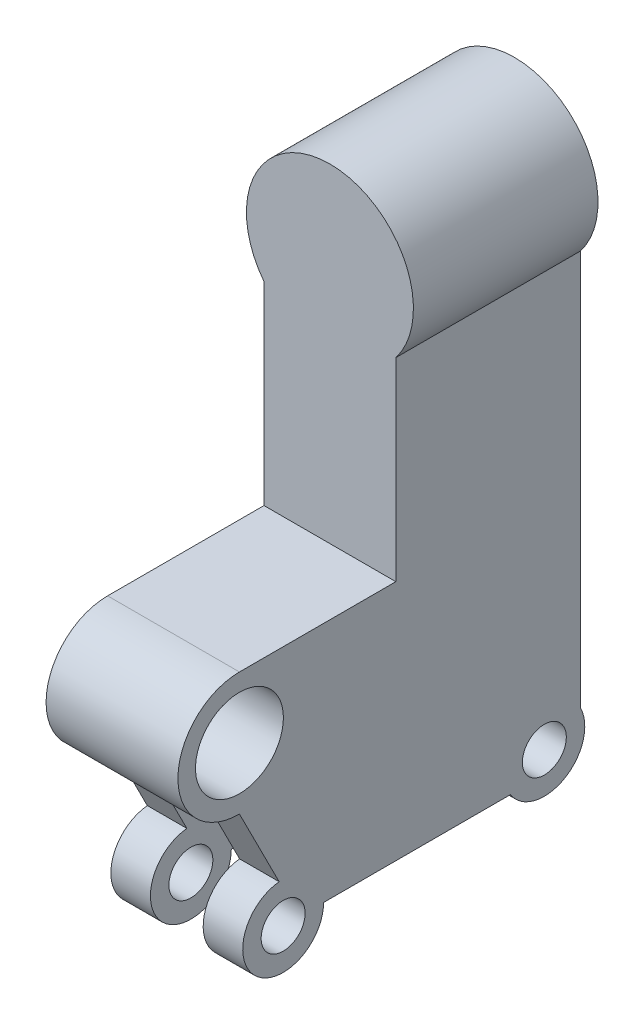
ISO-10303-21;
HEADER;
FILE_DESCRIPTION(('STEP AP214'),'2;1');
FILE_NAME('part.step','',(''),(''),'','','');
FILE_SCHEMA(('AUTOMOTIVE_DESIGN { 1 0 10303 214 1 1 1 1 }'));
ENDSEC;
DATA;
#1=APPLICATION_CONTEXT('core data for automotive mechanical design processes');
#2=APPLICATION_PROTOCOL_DEFINITION('international standard','automotive_design',2000,#1);
#3=PRODUCT_CONTEXT('',#1,'mechanical');
#4=PRODUCT('Part','Part','',(#3));
#5=PRODUCT_RELATED_PRODUCT_CATEGORY('part','',(#4));
#6=PRODUCT_DEFINITION_FORMATION('','',#4);
#7=PRODUCT_DEFINITION_CONTEXT('part definition',#1,'design');
#8=PRODUCT_DEFINITION('design','',#6,#7);
#9=PRODUCT_DEFINITION_SHAPE('','',#8);
#10=(LENGTH_UNIT() NAMED_UNIT(*) SI_UNIT(.MILLI.,.METRE.));
#11=(NAMED_UNIT(*) PLANE_ANGLE_UNIT() SI_UNIT($,.RADIAN.));
#12=(NAMED_UNIT(*) SI_UNIT($,.STERADIAN.) SOLID_ANGLE_UNIT());
#13=UNCERTAINTY_MEASURE_WITH_UNIT(LENGTH_MEASURE(1.E-05),#10,'distance_accuracy_value','');
#14=(GEOMETRIC_REPRESENTATION_CONTEXT(3) GLOBAL_UNCERTAINTY_ASSIGNED_CONTEXT((#13)) GLOBAL_UNIT_ASSIGNED_CONTEXT((#10,
#11,#12)) REPRESENTATION_CONTEXT('',''));
#15=CARTESIAN_POINT('',(0.,0.,0.));
#16=DIRECTION('',(0.,0.,1.));
#17=DIRECTION('',(1.,0.,0.));
#18=AXIS2_PLACEMENT_3D('',#15,#16,#17);
#19=CARTESIAN_POINT('',(15.,-18.,-34.6877878076393));
#20=DIRECTION('',(-1.,0.,0.));
#21=DIRECTION('',(0.,0.,1.));
#22=AXIS2_PLACEMENT_3D('',#19,#20,#21);
#23=CYLINDRICAL_SURFACE('',#22,4.6);
#24=CARTESIAN_POINT('',(4.5,-18.,-34.6877878076393));
#25=DIRECTION('',(-1.,0.,0.));
#26=DIRECTION('',(0.,0.,1.));
#27=AXIS2_PLACEMENT_3D('',#24,#25,#26);
#28=CIRCLE('',#27,4.6);
#29=CARTESIAN_POINT('',(4.5,-15.9227624252563,-38.7920641212021));
#30=VERTEX_POINT('',#29);
#31=CARTESIAN_POINT('',(4.5,-20.5,-30.8264408923777));
#32=VERTEX_POINT('',#31);
#33=EDGE_CURVE('E368',#30,#32,#28,.T.);
#34=ORIENTED_EDGE('',*,*,#33,.T.);
#35=DIRECTION('',(-1.,0.,0.));
#36=VECTOR('',#35,1.);
#37=CARTESIAN_POINT('',(15.,-20.5,-30.8264408923777));
#38=LINE('',#37,#36);
#39=CARTESIAN_POINT('',(0.,-20.5,-30.8264408923777));
#40=VERTEX_POINT('',#39);
#41=EDGE_CURVE('E160',#32,#40,#38,.T.);
#42=ORIENTED_EDGE('',*,*,#41,.T.);
#43=CARTESIAN_POINT('',(0.,-18.,-34.6877878076393));
#44=DIRECTION('',(1.,0.,0.));
#45=DIRECTION('',(0.,0.,-1.));
#46=AXIS2_PLACEMENT_3D('',#43,#44,#45);
#47=CIRCLE('',#46,4.6);
#48=CARTESIAN_POINT('',(0.,-15.9227624252563,-38.7920641212021));
#49=VERTEX_POINT('',#48);
#50=EDGE_CURVE('E199',#40,#49,#47,.T.);
#51=ORIENTED_EDGE('',*,*,#50,.T.);
#52=DIRECTION('',(-1.,0.,0.));
#53=VECTOR('',#52,1.);
#54=CARTESIAN_POINT('',(15.,-15.9227624252563,-38.7920641212021));
#55=LINE('',#54,#53);
#56=EDGE_CURVE('E161',#30,#49,#55,.T.);
#57=ORIENTED_EDGE('',*,*,#56,.F.);
#58=EDGE_LOOP('',(#34,#42,#51,#57));
#59=FACE_BOUND('',#58,.T.);
#60=ADVANCED_FACE('F55',(#59),#23,.T.);
#61=CARTESIAN_POINT('',(15.,-20.5,-4.97195036885488));
#62=DIRECTION('',(-1.,0.,0.));
#63=DIRECTION('',(0.,0.,1.));
#64=AXIS2_PLACEMENT_3D('',#61,#62,#63);
#65=CYLINDRICAL_SURFACE('',#64,4.6);
#66=CARTESIAN_POINT('',(10.5,-20.5,-4.97195036885488));
#67=DIRECTION('',(1.,0.,0.));
#68=DIRECTION('',(0.,0.,-1.));
#69=AXIS2_PLACEMENT_3D('',#66,#67,#68);
#70=CIRCLE('',#69,4.6);
#71=CARTESIAN_POINT('',(10.5,-15.9227624252563,-4.51489874774993));
#72=VERTEX_POINT('',#71);
#73=CARTESIAN_POINT('',(10.5,-20.5,-9.57195036885487));
#74=VERTEX_POINT('',#73);
#75=EDGE_CURVE('E314',#72,#74,#70,.T.);
#76=ORIENTED_EDGE('',*,*,#75,.T.);
#77=DIRECTION('',(-1.,0.,0.));
#78=VECTOR('',#77,1.);
#79=CARTESIAN_POINT('',(15.,-20.5,-9.57195036885487));
#80=LINE('',#79,#78);
#81=CARTESIAN_POINT('',(15.,-20.5,-9.57195036885487));
#82=VERTEX_POINT('',#81);
#83=EDGE_CURVE('E224',#82,#74,#80,.T.);
#84=ORIENTED_EDGE('',*,*,#83,.F.);
#85=CARTESIAN_POINT('',(15.,-20.5,-4.97195036885488));
#86=DIRECTION('',(1.,0.,0.));
#87=DIRECTION('',(0.,0.,-1.));
#88=AXIS2_PLACEMENT_3D('',#85,#86,#87);
#89=CIRCLE('',#88,4.6);
#90=CARTESIAN_POINT('',(15.,-15.9227624252563,-4.51489874774993));
#91=VERTEX_POINT('',#90);
#92=EDGE_CURVE('E286',#91,#82,#89,.T.);
#93=ORIENTED_EDGE('',*,*,#92,.F.);
#94=DIRECTION('',(-1.,0.,0.));
#95=VECTOR('',#94,1.);
#96=CARTESIAN_POINT('',(15.,-15.9227624252563,-4.51489874774993));
#97=LINE('',#96,#95);
#98=EDGE_CURVE('E229',#91,#72,#97,.T.);
#99=ORIENTED_EDGE('',*,*,#98,.T.);
#100=EDGE_LOOP('',(#76,#84,#93,#99));
#101=FACE_BOUND('',#100,.T.);
#102=ADVANCED_FACE('F311',(#101),#65,.T.);
#103=CARTESIAN_POINT('',(15.,-20.5,-4.97195036885488));
#104=DIRECTION('',(-1.,0.,0.));
#105=DIRECTION('',(0.,0.,1.));
#106=AXIS2_PLACEMENT_3D('',#103,#104,#105);
#107=CYLINDRICAL_SURFACE('',#106,2.5);
#108=CARTESIAN_POINT('',(15.,-20.5,-4.97195036885488));
#109=DIRECTION('',(1.,0.,0.));
#110=DIRECTION('',(0.,0.,-1.));
#111=AXIS2_PLACEMENT_3D('',#108,#109,#110);
#112=CIRCLE('',#111,2.5);
#113=CARTESIAN_POINT('',(15.,-20.5,-7.47195036885487));
#114=VERTEX_POINT('',#113);
#115=EDGE_CURVE('E264',#114,#114,#112,.T.);
#116=ORIENTED_EDGE('',*,*,#115,.T.);
#117=EDGE_LOOP('',(#116));
#118=FACE_BOUND('',#117,.T.);
#119=CARTESIAN_POINT('',(10.5,-20.5,-4.97195036885488));
#120=DIRECTION('',(1.,0.,0.));
#121=DIRECTION('',(0.,0.,-1.));
#122=AXIS2_PLACEMENT_3D('',#119,#120,#121);
#123=CIRCLE('',#122,2.5);
#124=CARTESIAN_POINT('',(10.5,-20.5,-7.47195036885487));
#125=VERTEX_POINT('',#124);
#126=EDGE_CURVE('E357',#125,#125,#123,.T.);
#127=ORIENTED_EDGE('',*,*,#126,.F.);
#128=EDGE_LOOP('',(#127));
#129=FACE_BOUND('',#128,.T.);
#130=ADVANCED_FACE('F433',(#118,#129),#107,.F.);
#131=CARTESIAN_POINT('',(15.,-20.5,-9.57195036885487));
#132=DIRECTION('',(0.,1.,0.));
#133=DIRECTION('',(0.,0.,1.));
#134=AXIS2_PLACEMENT_3D('',#131,#132,#133);
#135=PLANE('',#134);
#136=ORIENTED_EDGE('',*,*,#83,.T.);
#137=DIRECTION('',(0.,0.,1.));
#138=VECTOR('',#137,1.);
#139=CARTESIAN_POINT('',(10.5,-20.5,-39.2877878076393));
#140=LINE('',#139,#138);
#141=CARTESIAN_POINT('',(10.5,-20.5,-30.8264408923777));
#142=VERTEX_POINT('',#141);
#143=EDGE_CURVE('E319',#142,#74,#140,.T.);
#144=ORIENTED_EDGE('',*,*,#143,.F.);
#145=CARTESIAN_POINT('',(15.,-20.5,-30.8264408923777));
#146=VERTEX_POINT('',#145);
#147=EDGE_CURVE('E220',#146,#142,#38,.T.);
#148=ORIENTED_EDGE('',*,*,#147,.F.);
#149=DIRECTION('',(0.,0.,-1.));
#150=VECTOR('',#149,1.);
#151=CARTESIAN_POINT('',(15.,-20.5,-9.57195036885487));
#152=LINE('',#151,#150);
#153=EDGE_CURVE('E143',#82,#146,#152,.T.);
#154=ORIENTED_EDGE('',*,*,#153,.F.);
#155=EDGE_LOOP('',(#136,#144,#148,#154));
#156=FACE_BOUND('',#155,.T.);
#157=ADVANCED_FACE('F249',(#156),#135,.F.);
#158=CARTESIAN_POINT('',(15.,-18.,-34.6877878076393));
#159=DIRECTION('',(-1.,0.,0.));
#160=DIRECTION('',(0.,0.,1.));
#161=AXIS2_PLACEMENT_3D('',#158,#159,#160);
#162=CYLINDRICAL_SURFACE('',#161,2.5);
#163=CARTESIAN_POINT('',(10.5,-18.,-34.6877878076393));
#164=DIRECTION('',(1.,0.,0.));
#165=DIRECTION('',(0.,0.,-1.));
#166=AXIS2_PLACEMENT_3D('',#163,#164,#165);
#167=CIRCLE('',#166,2.5);
#168=CARTESIAN_POINT('',(10.5,-18.,-37.1877878076393));
#169=VERTEX_POINT('',#168);
#170=EDGE_CURVE('E64',#169,#169,#167,.T.);
#171=ORIENTED_EDGE('',*,*,#170,.F.);
#172=EDGE_LOOP('',(#171));
#173=FACE_BOUND('',#172,.T.);
#174=CARTESIAN_POINT('',(15.,-18.,-34.6877878076393));
#175=DIRECTION('',(1.,0.,0.));
#176=DIRECTION('',(0.,0.,-1.));
#177=AXIS2_PLACEMENT_3D('',#174,#175,#176);
#178=CIRCLE('',#177,2.5);
#179=CARTESIAN_POINT('',(15.,-18.,-37.1877878076393));
#180=VERTEX_POINT('',#179);
#181=EDGE_CURVE('E254',#180,#180,#178,.T.);
#182=ORIENTED_EDGE('',*,*,#181,.T.);
#183=EDGE_LOOP('',(#182));
#184=FACE_BOUND('',#183,.T.);
#185=ADVANCED_FACE('F246',(#173,#184),#162,.F.);
#186=CARTESIAN_POINT('',(15.,0.,0.));
#187=DIRECTION('',(1.,0.,0.));
#188=DIRECTION('',(0.,0.,-1.));
#189=AXIS2_PLACEMENT_3D('',#186,#187,#188);
#190=PLANE('',#189);
#191=ORIENTED_EDGE('',*,*,#115,.F.);
#192=EDGE_LOOP('',(#191));
#193=FACE_BOUND('',#192,.T.);
#194=CARTESIAN_POINT('',(15.,0.,0.));
#195=DIRECTION('',(1.,0.,0.));
#196=DIRECTION('',(0.,0.,-1.));
#197=AXIS2_PLACEMENT_3D('',#194,#195,#196);
#198=CIRCLE('',#197,7.);
#199=CARTESIAN_POINT('',(15.,7.,0.));
#200=VERTEX_POINT('',#199);
#201=CARTESIAN_POINT('',(15.,-7.,0.));
#202=VERTEX_POINT('',#201);
#203=EDGE_CURVE('E214',#200,#202,#198,.T.);
#204=ORIENTED_EDGE('',*,*,#203,.T.);
#205=DIRECTION('',(0.,-0.892276242525633,-0.451489874774993));
#206=VECTOR('',#205,1.);
#207=CARTESIAN_POINT('',(15.,-7.,0.));
#208=LINE('',#207,#206);
#209=EDGE_CURVE('E121',#202,#91,#208,.T.);
#210=ORIENTED_EDGE('',*,*,#209,.T.);
#211=ORIENTED_EDGE('',*,*,#92,.T.);
#212=ORIENTED_EDGE('',*,*,#153,.T.);
#213=CARTESIAN_POINT('',(15.,-18.,-34.6877878076393));
#214=DIRECTION('',(1.,0.,0.));
#215=DIRECTION('',(0.,0.,-1.));
#216=AXIS2_PLACEMENT_3D('',#213,#214,#215);
#217=CIRCLE('',#216,4.6);
#218=CARTESIAN_POINT('',(15.,-15.9227624252563,-38.7920641212021));
#219=VERTEX_POINT('',#218);
#220=EDGE_CURVE('E134',#146,#219,#217,.T.);
#221=ORIENTED_EDGE('',*,*,#220,.T.);
#222=DIRECTION('',(0.,1.,0.));
#223=VECTOR('',#222,1.);
#224=CARTESIAN_POINT('',(15.,-15.9227624252563,-38.7920641212021));
#225=LINE('',#224,#223);
#226=CARTESIAN_POINT('',(15.,29.0772375747437,-38.7920641212021));
#227=VERTEX_POINT('',#226);
#228=EDGE_CURVE('E141',#219,#227,#225,.T.);
#229=ORIENTED_EDGE('',*,*,#228,.T.);
#230=DIRECTION('',(0.,0.,1.));
#231=VECTOR('',#230,1.);
#232=CARTESIAN_POINT('',(15.,29.0772375747437,-17.7920641212021));
#233=LINE('',#232,#231);
#234=CARTESIAN_POINT('',(15.,29.0772375747437,-17.7920641212021));
#235=VERTEX_POINT('',#234);
#236=EDGE_CURVE('E169',#227,#235,#233,.T.);
#237=ORIENTED_EDGE('',*,*,#236,.T.);
#238=DIRECTION('',(0.,-1.,0.));
#239=VECTOR('',#238,1.);
#240=CARTESIAN_POINT('',(15.,7.,-17.7920641212021));
#241=LINE('',#240,#239);
#242=CARTESIAN_POINT('',(15.,7.,-17.7920641212021));
#243=VERTEX_POINT('',#242);
#244=EDGE_CURVE('E173',#235,#243,#241,.T.);
#245=ORIENTED_EDGE('',*,*,#244,.T.);
#246=DIRECTION('',(0.,0.,1.));
#247=VECTOR('',#246,1.);
#248=CARTESIAN_POINT('',(15.,7.,0.));
#249=LINE('',#248,#247);
#250=EDGE_CURVE('E79',#243,#200,#249,.T.);
#251=ORIENTED_EDGE('',*,*,#250,.T.);
#252=EDGE_LOOP('',(#204,#210,#211,#212,#221,#229,#237,#245,#251));
#253=FACE_BOUND('',#252,.T.);
#254=CARTESIAN_POINT('',(15.,0.,0.));
#255=DIRECTION('',(1.,0.,0.));
#256=DIRECTION('',(0.,0.,-1.));
#257=AXIS2_PLACEMENT_3D('',#254,#255,#256);
#258=CIRCLE('',#257,5.);
#259=CARTESIAN_POINT('',(15.,0.,-5.));
#260=VERTEX_POINT('',#259);
#261=EDGE_CURVE('E187',#260,#260,#258,.T.);
#262=ORIENTED_EDGE('',*,*,#261,.F.);
#263=EDGE_LOOP('',(#262));
#264=FACE_BOUND('',#263,.T.);
#265=ORIENTED_EDGE('',*,*,#181,.F.);
#266=EDGE_LOOP('',(#265));
#267=FACE_BOUND('',#266,.T.);
#268=ADVANCED_FACE('F136',(#193,#253,#264,#267),#190,.T.);
#269=CARTESIAN_POINT('',(0.,0.,0.));
#270=DIRECTION('',(1.,0.,0.));
#271=DIRECTION('',(0.,0.,-1.));
#272=AXIS2_PLACEMENT_3D('',#269,#270,#271);
#273=PLANE('',#272);
#274=CARTESIAN_POINT('',(0.,0.,0.));
#275=DIRECTION('',(1.,0.,0.));
#276=DIRECTION('',(0.,0.,-1.));
#277=AXIS2_PLACEMENT_3D('',#274,#275,#276);
#278=CIRCLE('',#277,7.);
#279=CARTESIAN_POINT('',(0.,7.,0.));
#280=VERTEX_POINT('',#279);
#281=CARTESIAN_POINT('',(0.,-7.,0.));
#282=VERTEX_POINT('',#281);
#283=EDGE_CURVE('E182',#280,#282,#278,.T.);
#284=ORIENTED_EDGE('',*,*,#283,.F.);
#285=DIRECTION('',(0.,0.,1.));
#286=VECTOR('',#285,1.);
#287=CARTESIAN_POINT('',(0.,7.,0.));
#288=LINE('',#287,#286);
#289=CARTESIAN_POINT('',(0.,7.,-17.7920641212021));
#290=VERTEX_POINT('',#289);
#291=EDGE_CURVE('E112',#290,#280,#288,.T.);
#292=ORIENTED_EDGE('',*,*,#291,.F.);
#293=DIRECTION('',(0.,-1.,0.));
#294=VECTOR('',#293,1.);
#295=CARTESIAN_POINT('',(0.,7.,-17.7920641212021));
#296=LINE('',#295,#294);
#297=CARTESIAN_POINT('',(0.,29.0772375747437,-17.7920641212021));
#298=VERTEX_POINT('',#297);
#299=EDGE_CURVE('E209',#298,#290,#296,.T.);
#300=ORIENTED_EDGE('',*,*,#299,.F.);
#301=DIRECTION('',(0.,0.,1.));
#302=VECTOR('',#301,1.);
#303=CARTESIAN_POINT('',(0.,29.0772375747437,-17.7920641212021));
#304=LINE('',#303,#302);
#305=CARTESIAN_POINT('',(0.,29.0772375747437,-38.7920641212021));
#306=VERTEX_POINT('',#305);
#307=EDGE_CURVE('E206',#306,#298,#304,.T.);
#308=ORIENTED_EDGE('',*,*,#307,.F.);
#309=DIRECTION('',(0.,1.,0.));
#310=VECTOR('',#309,1.);
#311=CARTESIAN_POINT('',(0.,-15.9227624252563,-38.7920641212021));
#312=LINE('',#311,#310);
#313=EDGE_CURVE('E203',#49,#306,#312,.T.);
#314=ORIENTED_EDGE('',*,*,#313,.F.);
#315=ORIENTED_EDGE('',*,*,#50,.F.);
#316=DIRECTION('',(0.,0.,-1.));
#317=VECTOR('',#316,1.);
#318=CARTESIAN_POINT('',(0.,-20.5,-9.57195036885487));
#319=LINE('',#318,#317);
#320=CARTESIAN_POINT('',(0.,-20.5,-9.57195036885487));
#321=VERTEX_POINT('',#320);
#322=EDGE_CURVE('E195',#321,#40,#319,.T.);
#323=ORIENTED_EDGE('',*,*,#322,.F.);
#324=CARTESIAN_POINT('',(0.,-20.5,-4.97195036885488));
#325=DIRECTION('',(1.,0.,0.));
#326=DIRECTION('',(0.,0.,-1.));
#327=AXIS2_PLACEMENT_3D('',#324,#325,#326);
#328=CIRCLE('',#327,4.6);
#329=CARTESIAN_POINT('',(0.,-15.9227624252563,-4.51489874774993));
#330=VERTEX_POINT('',#329);
#331=EDGE_CURVE('E191',#330,#321,#328,.T.);
#332=ORIENTED_EDGE('',*,*,#331,.F.);
#333=DIRECTION('',(0.,-0.892276242525633,-0.451489874774993));
#334=VECTOR('',#333,1.);
#335=CARTESIAN_POINT('',(0.,-7.,0.));
#336=LINE('',#335,#334);
#337=EDGE_CURVE('E186',#282,#330,#336,.T.);
#338=ORIENTED_EDGE('',*,*,#337,.F.);
#339=EDGE_LOOP('',(#284,#292,#300,#308,#314,#315,#323,#332,#338));
#340=FACE_BOUND('',#339,.T.);
#341=CARTESIAN_POINT('',(0.,0.,0.));
#342=DIRECTION('',(1.,0.,0.));
#343=DIRECTION('',(0.,0.,-1.));
#344=AXIS2_PLACEMENT_3D('',#341,#342,#343);
#345=CIRCLE('',#344,5.);
#346=CARTESIAN_POINT('',(0.,0.,-5.));
#347=VERTEX_POINT('',#346);
#348=EDGE_CURVE('E274',#347,#347,#345,.T.);
#349=ORIENTED_EDGE('',*,*,#348,.T.);
#350=EDGE_LOOP('',(#349));
#351=FACE_BOUND('',#350,.T.);
#352=CARTESIAN_POINT('',(0.,-20.5,-4.97195036885488));
#353=DIRECTION('',(1.,0.,0.));
#354=DIRECTION('',(0.,0.,-1.));
#355=AXIS2_PLACEMENT_3D('',#352,#353,#354);
#356=CIRCLE('',#355,2.5);
#357=CARTESIAN_POINT('',(0.,-20.5,-7.47195036885487));
#358=VERTEX_POINT('',#357);
#359=EDGE_CURVE('E257',#358,#358,#356,.T.);
#360=ORIENTED_EDGE('',*,*,#359,.T.);
#361=EDGE_LOOP('',(#360));
#362=FACE_BOUND('',#361,.T.);
#363=CARTESIAN_POINT('',(0.,-18.,-34.6877878076393));
#364=DIRECTION('',(1.,0.,0.));
#365=DIRECTION('',(0.,0.,-1.));
#366=AXIS2_PLACEMENT_3D('',#363,#364,#365);
#367=CIRCLE('',#366,2.5);
#368=CARTESIAN_POINT('',(0.,-18.,-37.1877878076393));
#369=VERTEX_POINT('',#368);
#370=EDGE_CURVE('E258',#369,#369,#367,.T.);
#371=ORIENTED_EDGE('',*,*,#370,.T.);
#372=EDGE_LOOP('',(#371));
#373=FACE_BOUND('',#372,.T.);
#374=ADVANCED_FACE('F445',(#340,#351,#362,#373),#273,.F.);
#375=CARTESIAN_POINT('',(15.,0.,0.));
#376=DIRECTION('',(-1.,0.,0.));
#377=DIRECTION('',(0.,0.,1.));
#378=AXIS2_PLACEMENT_3D('',#375,#376,#377);
#379=CYLINDRICAL_SURFACE('',#378,7.);
#380=ORIENTED_EDGE('',*,*,#283,.T.);
#381=DIRECTION('',(-1.,0.,0.));
#382=VECTOR('',#381,1.);
#383=CARTESIAN_POINT('',(15.,-7.,0.));
#384=LINE('',#383,#382);
#385=EDGE_CURVE('E233',#202,#282,#384,.T.);
#386=ORIENTED_EDGE('',*,*,#385,.F.);
#387=ORIENTED_EDGE('',*,*,#203,.F.);
#388=DIRECTION('',(-1.,0.,0.));
#389=VECTOR('',#388,1.);
#390=CARTESIAN_POINT('',(15.,7.,0.));
#391=LINE('',#390,#389);
#392=EDGE_CURVE('E181',#200,#280,#391,.T.);
#393=ORIENTED_EDGE('',*,*,#392,.T.);
#394=EDGE_LOOP('',(#380,#386,#387,#393));
#395=FACE_BOUND('',#394,.T.);
#396=ADVANCED_FACE('F57',(#395),#379,.T.);
#397=CARTESIAN_POINT('',(15.,-7.,0.));
#398=DIRECTION('',(0.,0.451489874774993,-0.892276242525633));
#399=DIRECTION('',(0.,0.892276242525633,0.451489874774993));
#400=AXIS2_PLACEMENT_3D('',#397,#398,#399);
#401=PLANE('',#400);
#402=DIRECTION('',(-1.,0.,0.));
#403=VECTOR('',#402,1.);
#404=CARTESIAN_POINT('',(15.,-9.5,-1.26499466548898));
#405=LINE('',#404,#403);
#406=CARTESIAN_POINT('',(10.5,-9.5,-1.26499466548898));
#407=VERTEX_POINT('',#406);
#408=CARTESIAN_POINT('',(4.49999999999999,-9.5,-1.26499466548898));
#409=VERTEX_POINT('',#408);
#410=EDGE_CURVE('E267',#407,#409,#405,.T.);
#411=ORIENTED_EDGE('',*,*,#410,.F.);
#412=DIRECTION('',(0.,-0.892276242525633,-0.451489874774993));
#413=VECTOR('',#412,1.);
#414=CARTESIAN_POINT('',(10.5,-7.,0.));
#415=LINE('',#414,#413);
#416=EDGE_CURVE('E341',#407,#72,#415,.T.);
#417=ORIENTED_EDGE('',*,*,#416,.T.);
#418=ORIENTED_EDGE('',*,*,#98,.F.);
#419=ORIENTED_EDGE('',*,*,#209,.F.);
#420=ORIENTED_EDGE('',*,*,#385,.T.);
#421=ORIENTED_EDGE('',*,*,#337,.T.);
#422=CARTESIAN_POINT('',(4.49999999999999,-15.9227624252563,-4.51489874774993));
#423=VERTEX_POINT('',#422);
#424=EDGE_CURVE('E228',#423,#330,#97,.T.);
#425=ORIENTED_EDGE('',*,*,#424,.F.);
#426=DIRECTION('',(0.,0.892276242525633,0.451489874774993));
#427=VECTOR('',#426,1.);
#428=CARTESIAN_POINT('',(4.49999999999999,-7.,0.));
#429=LINE('',#428,#427);
#430=EDGE_CURVE('E361',#423,#409,#429,.T.);
#431=ORIENTED_EDGE('',*,*,#430,.T.);
#432=EDGE_LOOP('',(#411,#417,#418,#419,#420,#421,#425,#431));
#433=FACE_BOUND('',#432,.T.);
#434=ADVANCED_FACE('F346',(#433),#401,.F.);
#435=CARTESIAN_POINT('',(4.5,-20.5,-9.57195036885487));
#436=VERTEX_POINT('',#435);
#437=EDGE_CURVE('E223',#436,#321,#80,.T.);
#438=ORIENTED_EDGE('',*,*,#437,.F.);
#439=CARTESIAN_POINT('',(4.49999999999999,-20.5,-4.97195036885488));
#440=DIRECTION('',(-1.,0.,0.));
#441=DIRECTION('',(0.,0.,1.));
#442=AXIS2_PLACEMENT_3D('',#439,#440,#441);
#443=CIRCLE('',#442,4.6);
#444=EDGE_CURVE('E364',#436,#423,#443,.T.);
#445=ORIENTED_EDGE('',*,*,#444,.T.);
#446=ORIENTED_EDGE('',*,*,#424,.T.);
#447=ORIENTED_EDGE('',*,*,#331,.T.);
#448=EDGE_LOOP('',(#438,#445,#446,#447));
#449=FACE_BOUND('',#448,.T.);
#450=ADVANCED_FACE('F435',(#449),#65,.T.);
#451=ORIENTED_EDGE('',*,*,#41,.F.);
#452=DIRECTION('',(0.,0.,-1.));
#453=VECTOR('',#452,1.);
#454=CARTESIAN_POINT('',(4.49999999999999,-20.5,-0.371950368854876));
#455=LINE('',#454,#453);
#456=EDGE_CURVE('E383',#436,#32,#455,.T.);
#457=ORIENTED_EDGE('',*,*,#456,.F.);
#458=ORIENTED_EDGE('',*,*,#437,.T.);
#459=ORIENTED_EDGE('',*,*,#322,.T.);
#460=EDGE_LOOP('',(#451,#457,#458,#459));
#461=FACE_BOUND('',#460,.T.);
#462=ADVANCED_FACE('F426',(#461),#135,.F.);
#463=ORIENTED_EDGE('',*,*,#147,.T.);
#464=CARTESIAN_POINT('',(10.5,-18.,-34.6877878076393));
#465=DIRECTION('',(1.,0.,0.));
#466=DIRECTION('',(0.,0.,-1.));
#467=AXIS2_PLACEMENT_3D('',#464,#465,#466);
#468=CIRCLE('',#467,4.6);
#469=CARTESIAN_POINT('',(10.5,-15.9227624252563,-38.7920641212021));
#470=VERTEX_POINT('',#469);
#471=EDGE_CURVE('E155',#142,#470,#468,.T.);
#472=ORIENTED_EDGE('',*,*,#471,.T.);
#473=EDGE_CURVE('E151',#219,#470,#55,.T.);
#474=ORIENTED_EDGE('',*,*,#473,.F.);
#475=ORIENTED_EDGE('',*,*,#220,.F.);
#476=EDGE_LOOP('',(#463,#472,#474,#475));
#477=FACE_BOUND('',#476,.T.);
#478=ADVANCED_FACE('F152',(#477),#23,.T.);
#479=CARTESIAN_POINT('',(15.,-15.9227624252563,-38.7920641212021));
#480=DIRECTION('',(0.,0.,1.));
#481=DIRECTION('',(1.,0.,0.));
#482=AXIS2_PLACEMENT_3D('',#479,#480,#481);
#483=PLANE('',#482);
#484=CARTESIAN_POINT('',(7.5,34.908189469589,-38.7920641212021));
#485=DIRECTION('',(0.,0.,-1.));
#486=DIRECTION('',(-1.,0.,0.));
#487=AXIS2_PLACEMENT_3D('',#484,#485,#486);
#488=CIRCLE('',#487,6.);
#489=CARTESIAN_POINT('',(1.5,34.908189469589,-38.7920641212021));
#490=VERTEX_POINT('',#489);
#491=EDGE_CURVE('E394',#490,#490,#488,.T.);
#492=ORIENTED_EDGE('',*,*,#491,.F.);
#493=EDGE_LOOP('',(#492));
#494=FACE_BOUND('',#493,.T.);
#495=ORIENTED_EDGE('',*,*,#473,.T.);
#496=DIRECTION('',(0.,1.,0.));
#497=VECTOR('',#496,1.);
#498=CARTESIAN_POINT('',(10.5,-15.9227624252563,-38.7920641212021));
#499=LINE('',#498,#497);
#500=CARTESIAN_POINT('',(10.5,-9.5,-38.7920641212021));
#501=VERTEX_POINT('',#500);
#502=EDGE_CURVE('E354',#470,#501,#499,.T.);
#503=ORIENTED_EDGE('',*,*,#502,.T.);
#504=DIRECTION('',(1.,0.,0.));
#505=VECTOR('',#504,1.);
#506=CARTESIAN_POINT('',(15.,-9.5,-38.7920641212021));
#507=LINE('',#506,#505);
#508=CARTESIAN_POINT('',(4.49999999999999,-9.5,-38.7920641212021));
#509=VERTEX_POINT('',#508);
#510=EDGE_CURVE('E13',#509,#501,#507,.T.);
#511=ORIENTED_EDGE('',*,*,#510,.F.);
#512=DIRECTION('',(0.,-1.,0.));
#513=VECTOR('',#512,1.);
#514=CARTESIAN_POINT('',(4.5,-15.9227624252563,-38.7920641212021));
#515=LINE('',#514,#513);
#516=EDGE_CURVE('E372',#509,#30,#515,.T.);
#517=ORIENTED_EDGE('',*,*,#516,.T.);
#518=ORIENTED_EDGE('',*,*,#56,.T.);
#519=ORIENTED_EDGE('',*,*,#313,.T.);
#520=CARTESIAN_POINT('',(7.5,34.908189469589,-38.7920641212021));
#521=DIRECTION('',(0.,0.,-1.));
#522=DIRECTION('',(-1.,0.,0.));
#523=AXIS2_PLACEMENT_3D('',#520,#521,#522);
#524=CIRCLE('',#523,9.5);
#525=EDGE_CURVE('E167',#227,#306,#524,.F.);
#526=ORIENTED_EDGE('',*,*,#525,.F.);
#527=ORIENTED_EDGE('',*,*,#228,.F.);
#528=EDGE_LOOP('',(#495,#503,#511,#517,#518,#519,#526,#527));
#529=FACE_BOUND('',#528,.T.);
#530=ADVANCED_FACE('F164',(#494,#529),#483,.F.);
#531=CARTESIAN_POINT('',(15.,7.,-17.7920641212021));
#532=DIRECTION('',(0.,0.,-1.));
#533=DIRECTION('',(-1.,0.,0.));
#534=AXIS2_PLACEMENT_3D('',#531,#532,#533);
#535=PLANE('',#534);
#536=CARTESIAN_POINT('',(7.5,34.908189469589,-17.7920641212021));
#537=DIRECTION('',(0.,0.,-1.));
#538=DIRECTION('',(-1.,0.,0.));
#539=AXIS2_PLACEMENT_3D('',#536,#537,#538);
#540=CIRCLE('',#539,9.5);
#541=EDGE_CURVE('E387',#298,#235,#540,.T.);
#542=ORIENTED_EDGE('',*,*,#541,.F.);
#543=ORIENTED_EDGE('',*,*,#299,.T.);
#544=DIRECTION('',(-1.,0.,0.));
#545=VECTOR('',#544,1.);
#546=CARTESIAN_POINT('',(15.,7.,-17.7920641212021));
#547=LINE('',#546,#545);
#548=EDGE_CURVE('E217',#243,#290,#547,.T.);
#549=ORIENTED_EDGE('',*,*,#548,.F.);
#550=ORIENTED_EDGE('',*,*,#244,.F.);
#551=EDGE_LOOP('',(#542,#543,#549,#550));
#552=FACE_BOUND('',#551,.T.);
#553=ADVANCED_FACE('F417',(#552),#535,.F.);
#554=CARTESIAN_POINT('',(15.,7.,0.));
#555=DIRECTION('',(0.,-1.,0.));
#556=DIRECTION('',(0.,0.,-1.));
#557=AXIS2_PLACEMENT_3D('',#554,#555,#556);
#558=PLANE('',#557);
#559=ORIENTED_EDGE('',*,*,#291,.T.);
#560=ORIENTED_EDGE('',*,*,#392,.F.);
#561=ORIENTED_EDGE('',*,*,#250,.F.);
#562=ORIENTED_EDGE('',*,*,#548,.T.);
#563=EDGE_LOOP('',(#559,#560,#561,#562));
#564=FACE_BOUND('',#563,.T.);
#565=ADVANCED_FACE('F423',(#564),#558,.F.);
#566=CARTESIAN_POINT('',(15.,0.,0.));
#567=DIRECTION('',(-1.,0.,0.));
#568=DIRECTION('',(0.,0.,1.));
#569=AXIS2_PLACEMENT_3D('',#566,#567,#568);
#570=CYLINDRICAL_SURFACE('',#569,5.);
#571=ORIENTED_EDGE('',*,*,#261,.T.);
#572=EDGE_LOOP('',(#571));
#573=FACE_BOUND('',#572,.T.);
#574=ORIENTED_EDGE('',*,*,#348,.F.);
#575=EDGE_LOOP('',(#574));
#576=FACE_BOUND('',#575,.T.);
#577=ADVANCED_FACE('F517',(#573,#576),#570,.F.);
#578=CARTESIAN_POINT('',(4.49999999999999,-20.5,-4.97195036885488));
#579=DIRECTION('',(-1.,0.,0.));
#580=DIRECTION('',(0.,0.,1.));
#581=AXIS2_PLACEMENT_3D('',#578,#579,#580);
#582=CIRCLE('',#581,2.5);
#583=CARTESIAN_POINT('',(4.49999999999999,-20.5,-2.47195036885488));
#584=VERTEX_POINT('',#583);
#585=EDGE_CURVE('E376',#584,#584,#582,.T.);
#586=ORIENTED_EDGE('',*,*,#585,.F.);
#587=EDGE_LOOP('',(#586));
#588=FACE_BOUND('',#587,.T.);
#589=ORIENTED_EDGE('',*,*,#359,.F.);
#590=EDGE_LOOP('',(#589));
#591=FACE_BOUND('',#590,.T.);
#592=ADVANCED_FACE('F509',(#588,#591),#107,.F.);
#593=CARTESIAN_POINT('',(4.5,-18.,-34.6877878076393));
#594=DIRECTION('',(-1.,0.,0.));
#595=DIRECTION('',(0.,0.,1.));
#596=AXIS2_PLACEMENT_3D('',#593,#594,#595);
#597=CIRCLE('',#596,2.5);
#598=CARTESIAN_POINT('',(4.5,-18.,-32.1877878076392));
#599=VERTEX_POINT('',#598);
#600=EDGE_CURVE('E236',#599,#599,#597,.T.);
#601=ORIENTED_EDGE('',*,*,#600,.F.);
#602=EDGE_LOOP('',(#601));
#603=FACE_BOUND('',#602,.T.);
#604=ORIENTED_EDGE('',*,*,#370,.F.);
#605=EDGE_LOOP('',(#604));
#606=FACE_BOUND('',#605,.T.);
#607=ADVANCED_FACE('F251',(#603,#606),#162,.F.);
#608=CARTESIAN_POINT('',(0.,-9.5,0.));
#609=DIRECTION('',(0.,-1.,0.));
#610=DIRECTION('',(0.,0.,-1.));
#611=AXIS2_PLACEMENT_3D('',#608,#609,#610);
#612=PLANE('',#611);
#613=ORIENTED_EDGE('',*,*,#410,.T.);
#614=DIRECTION('',(0.,0.,-1.));
#615=VECTOR('',#614,1.);
#616=CARTESIAN_POINT('',(4.49999999999999,-9.5,-0.371950368854876));
#617=LINE('',#616,#615);
#618=EDGE_CURVE('E70',#409,#509,#617,.T.);
#619=ORIENTED_EDGE('',*,*,#618,.T.);
#620=ORIENTED_EDGE('',*,*,#510,.T.);
#621=DIRECTION('',(0.,0.,1.));
#622=VECTOR('',#621,1.);
#623=CARTESIAN_POINT('',(10.5,-9.5,-39.2877878076393));
#624=LINE('',#623,#622);
#625=EDGE_CURVE('E380',#501,#407,#624,.T.);
#626=ORIENTED_EDGE('',*,*,#625,.T.);
#627=EDGE_LOOP('',(#613,#619,#620,#626));
#628=FACE_BOUND('',#627,.T.);
#629=ADVANCED_FACE('F501',(#628),#612,.T.);
#630=CARTESIAN_POINT('',(10.5,-9.5,-39.2877878076393));
#631=DIRECTION('',(1.,0.,0.));
#632=DIRECTION('',(0.,0.,-1.));
#633=AXIS2_PLACEMENT_3D('',#630,#631,#632);
#634=PLANE('',#633);
#635=ORIENTED_EDGE('',*,*,#502,.F.);
#636=ORIENTED_EDGE('',*,*,#471,.F.);
#637=ORIENTED_EDGE('',*,*,#143,.T.);
#638=ORIENTED_EDGE('',*,*,#75,.F.);
#639=ORIENTED_EDGE('',*,*,#416,.F.);
#640=ORIENTED_EDGE('',*,*,#625,.F.);
#641=EDGE_LOOP('',(#635,#636,#637,#638,#639,#640));
#642=FACE_BOUND('',#641,.T.);
#643=ORIENTED_EDGE('',*,*,#126,.T.);
#644=EDGE_LOOP('',(#643));
#645=FACE_BOUND('',#644,.T.);
#646=ORIENTED_EDGE('',*,*,#170,.T.);
#647=EDGE_LOOP('',(#646));
#648=FACE_BOUND('',#647,.T.);
#649=ADVANCED_FACE('F244',(#642,#645,#648),#634,.F.);
#650=CARTESIAN_POINT('',(4.49999999999999,-9.5,-0.371950368854876));
#651=DIRECTION('',(-1.,0.,0.));
#652=DIRECTION('',(0.,0.,1.));
#653=AXIS2_PLACEMENT_3D('',#650,#651,#652);
#654=PLANE('',#653);
#655=ORIENTED_EDGE('',*,*,#456,.T.);
#656=ORIENTED_EDGE('',*,*,#33,.F.);
#657=ORIENTED_EDGE('',*,*,#516,.F.);
#658=ORIENTED_EDGE('',*,*,#618,.F.);
#659=ORIENTED_EDGE('',*,*,#430,.F.);
#660=ORIENTED_EDGE('',*,*,#444,.F.);
#661=EDGE_LOOP('',(#655,#656,#657,#658,#659,#660));
#662=FACE_BOUND('',#661,.T.);
#663=ORIENTED_EDGE('',*,*,#585,.T.);
#664=EDGE_LOOP('',(#663));
#665=FACE_BOUND('',#664,.T.);
#666=ORIENTED_EDGE('',*,*,#600,.T.);
#667=EDGE_LOOP('',(#666));
#668=FACE_BOUND('',#667,.T.);
#669=ADVANCED_FACE('F498',(#662,#665,#668),#654,.F.);
#670=CARTESIAN_POINT('',(7.5,34.908189469589,6.62182712951952));
#671=DIRECTION('',(0.,0.,-1.));
#672=DIRECTION('',(-1.,0.,0.));
#673=AXIS2_PLACEMENT_3D('',#670,#671,#672);
#674=CYLINDRICAL_SURFACE('',#673,9.5);
#675=ORIENTED_EDGE('',*,*,#307,.T.);
#676=ORIENTED_EDGE('',*,*,#541,.T.);
#677=ORIENTED_EDGE('',*,*,#236,.F.);
#678=ORIENTED_EDGE('',*,*,#525,.T.);
#679=EDGE_LOOP('',(#675,#676,#677,#678));
#680=FACE_BOUND('',#679,.T.);
#681=ADVANCED_FACE('F412',(#680),#674,.T.);
#682=CARTESIAN_POINT('',(7.5,34.908189469589,6.62182712951952));
#683=DIRECTION('',(0.,0.,-1.));
#684=DIRECTION('',(-1.,0.,0.));
#685=AXIS2_PLACEMENT_3D('',#682,#683,#684);
#686=CYLINDRICAL_SURFACE('',#685,6.);
#687=CARTESIAN_POINT('',(7.5,34.908189469589,-23.2920641212021));
#688=DIRECTION('',(0.,0.,-1.));
#689=DIRECTION('',(-1.,0.,0.));
#690=AXIS2_PLACEMENT_3D('',#687,#688,#689);
#691=CIRCLE('',#690,6.);
#692=CARTESIAN_POINT('',(1.5,34.908189469589,-23.2920641212021));
#693=VERTEX_POINT('',#692);
#694=EDGE_CURVE('E398',#693,#693,#691,.T.);
#695=ORIENTED_EDGE('',*,*,#694,.F.);
#696=EDGE_LOOP('',(#695));
#697=FACE_BOUND('',#696,.T.);
#698=ORIENTED_EDGE('',*,*,#491,.T.);
#699=EDGE_LOOP('',(#698));
#700=FACE_BOUND('',#699,.T.);
#701=ADVANCED_FACE('F409',(#697,#700),#686,.F.);
#702=CARTESIAN_POINT('',(7.5,34.908189469589,-23.2920641212021));
#703=DIRECTION('',(0.,0.,-1.));
#704=DIRECTION('',(-1.,0.,0.));
#705=AXIS2_PLACEMENT_3D('',#702,#703,#704);
#706=PLANE('',#705);
#707=ORIENTED_EDGE('',*,*,#694,.T.);
#708=EDGE_LOOP('',(#707));
#709=FACE_BOUND('',#708,.T.);
#710=ADVANCED_FACE('F407',(#709),#706,.T.);
#711=CLOSED_SHELL('',(#60,#102,#130,#157,#185,#268,#374,#396,#434,#450,#462,#478,#530,#553,#565,
#577,#592,#607,#629,#649,#669,#681,#701,#710));
#712=MANIFOLD_SOLID_BREP('B2',#711);
#713=ADVANCED_BREP_SHAPE_REPRESENTATION('',(#18,#712),#14);
#714=SHAPE_DEFINITION_REPRESENTATION(#9,#713);
ENDSEC;
END-ISO-10303-21;
